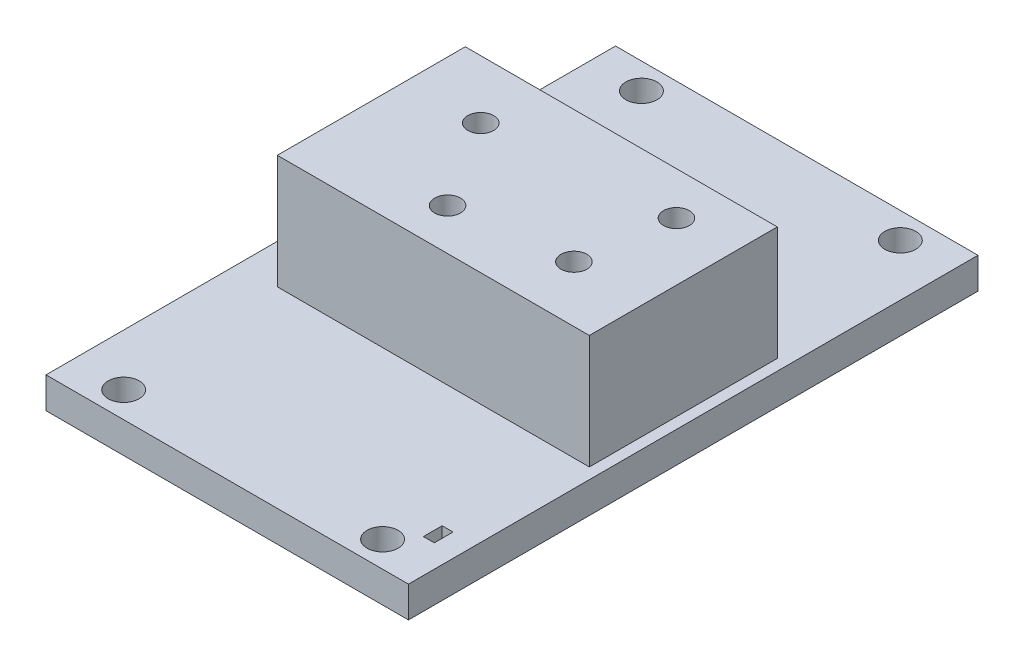
ISO-10303-21;
HEADER;
FILE_DESCRIPTION(('STEP AP214'),'2;1');
FILE_NAME('part.step','',(''),(''),'','','');
FILE_SCHEMA(('AUTOMOTIVE_DESIGN { 1 0 10303 214 1 1 1 1 }'));
ENDSEC;
DATA;
#1=APPLICATION_CONTEXT('core data for automotive mechanical design processes');
#2=APPLICATION_PROTOCOL_DEFINITION('international standard','automotive_design',2000,#1);
#3=PRODUCT_CONTEXT('',#1,'mechanical');
#4=PRODUCT('Part','Part','',(#3));
#5=PRODUCT_RELATED_PRODUCT_CATEGORY('part','',(#4));
#6=PRODUCT_DEFINITION_FORMATION('','',#4);
#7=PRODUCT_DEFINITION_CONTEXT('part definition',#1,'design');
#8=PRODUCT_DEFINITION('design','',#6,#7);
#9=PRODUCT_DEFINITION_SHAPE('','',#8);
#10=(LENGTH_UNIT() NAMED_UNIT(*) SI_UNIT(.MILLI.,.METRE.));
#11=(NAMED_UNIT(*) PLANE_ANGLE_UNIT() SI_UNIT($,.RADIAN.));
#12=(NAMED_UNIT(*) SI_UNIT($,.STERADIAN.) SOLID_ANGLE_UNIT());
#13=UNCERTAINTY_MEASURE_WITH_UNIT(LENGTH_MEASURE(1.E-05),#10,'distance_accuracy_value','');
#14=(GEOMETRIC_REPRESENTATION_CONTEXT(3) GLOBAL_UNCERTAINTY_ASSIGNED_CONTEXT((#13)) GLOBAL_UNIT_ASSIGNED_CONTEXT((#10,
#11,#12)) REPRESENTATION_CONTEXT('',''));
#15=CARTESIAN_POINT('',(0.,0.,0.));
#16=DIRECTION('',(0.,0.,1.));
#17=DIRECTION('',(1.,0.,0.));
#18=AXIS2_PLACEMENT_3D('',#15,#16,#17);
#19=CARTESIAN_POINT('',(0.,3.,0.));
#20=DIRECTION('',(0.,-1.,0.));
#21=DIRECTION('',(0.,0.,-1.));
#22=AXIS2_PLACEMENT_3D('',#19,#20,#21);
#23=PLANE('',#22);
#24=DIRECTION('',(0.,0.,-1.));
#25=VECTOR('',#24,1.);
#26=CARTESIAN_POINT('',(15.2972184874862,3.,20.9911873137618));
#27=LINE('',#26,#25);
#28=CARTESIAN_POINT('',(15.2972184874862,3.,22.8012740109835));
#29=VERTEX_POINT('',#28);
#30=CARTESIAN_POINT('',(15.2972184874862,3.,20.9911873137618));
#31=VERTEX_POINT('',#30);
#32=EDGE_CURVE('E245',#29,#31,#27,.T.);
#33=ORIENTED_EDGE('',*,*,#32,.F.);
#34=DIRECTION('',(1.,0.,0.));
#35=VECTOR('',#34,1.);
#36=CARTESIAN_POINT('',(14.243954382696,3.,22.8012740109835));
#37=LINE('',#36,#35);
#38=CARTESIAN_POINT('',(14.243954382696,3.,22.8012740109835));
#39=VERTEX_POINT('',#38);
#40=EDGE_CURVE('E253',#39,#29,#37,.T.);
#41=ORIENTED_EDGE('',*,*,#40,.F.);
#42=DIRECTION('',(0.,0.,1.));
#43=VECTOR('',#42,1.);
#44=CARTESIAN_POINT('',(14.243954382696,3.,20.9911873137618));
#45=LINE('',#44,#43);
#46=CARTESIAN_POINT('',(14.243954382696,3.,20.9911873137618));
#47=VERTEX_POINT('',#46);
#48=EDGE_CURVE('E250',#47,#39,#45,.T.);
#49=ORIENTED_EDGE('',*,*,#48,.F.);
#50=DIRECTION('',(-1.,0.,0.));
#51=VECTOR('',#50,1.);
#52=CARTESIAN_POINT('',(14.243954382696,3.,20.9911873137618));
#53=LINE('',#52,#51);
#54=EDGE_CURVE('E247',#31,#47,#53,.T.);
#55=ORIENTED_EDGE('',*,*,#54,.F.);
#56=EDGE_LOOP('',(#33,#41,#49,#55));
#57=FACE_BOUND('',#56,.T.);
#58=DIRECTION('',(0.,0.,-1.));
#59=VECTOR('',#58,1.);
#60=CARTESIAN_POINT('',(17.5,3.,27.5));
#61=LINE('',#60,#59);
#62=CARTESIAN_POINT('',(17.5,3.,27.5));
#63=VERTEX_POINT('',#62);
#64=CARTESIAN_POINT('',(17.5,3.,-27.5));
#65=VERTEX_POINT('',#64);
#66=EDGE_CURVE('E300',#63,#65,#61,.T.);
#67=ORIENTED_EDGE('',*,*,#66,.T.);
#68=DIRECTION('',(-1.,0.,0.));
#69=VECTOR('',#68,1.);
#70=CARTESIAN_POINT('',(-17.5,3.,-27.5));
#71=LINE('',#70,#69);
#72=CARTESIAN_POINT('',(-17.5,3.,-27.5));
#73=VERTEX_POINT('',#72);
#74=EDGE_CURVE('E303',#65,#73,#71,.T.);
#75=ORIENTED_EDGE('',*,*,#74,.T.);
#76=DIRECTION('',(0.,0.,1.));
#77=VECTOR('',#76,1.);
#78=CARTESIAN_POINT('',(-17.5,3.,27.5));
#79=LINE('',#78,#77);
#80=CARTESIAN_POINT('',(-17.5,3.,27.5));
#81=VERTEX_POINT('',#80);
#82=EDGE_CURVE('E306',#73,#81,#79,.T.);
#83=ORIENTED_EDGE('',*,*,#82,.T.);
#84=DIRECTION('',(1.,0.,0.));
#85=VECTOR('',#84,1.);
#86=CARTESIAN_POINT('',(-17.5,3.,27.5));
#87=LINE('',#86,#85);
#88=EDGE_CURVE('E308',#81,#63,#87,.T.);
#89=ORIENTED_EDGE('',*,*,#88,.T.);
#90=EDGE_LOOP('',(#67,#75,#83,#89));
#91=FACE_BOUND('',#90,.T.);
#92=CARTESIAN_POINT('',(12.5,3.,-25.));
#93=DIRECTION('',(0.,1.,0.));
#94=DIRECTION('',(0.,0.,1.));
#95=AXIS2_PLACEMENT_3D('',#92,#93,#94);
#96=CIRCLE('',#95,1.5);
#97=CARTESIAN_POINT('',(12.5,3.,-23.5));
#98=VERTEX_POINT('',#97);
#99=EDGE_CURVE('E294',#98,#98,#96,.T.);
#100=ORIENTED_EDGE('',*,*,#99,.F.);
#101=EDGE_LOOP('',(#100));
#102=FACE_BOUND('',#101,.T.);
#103=CARTESIAN_POINT('',(-12.5,3.,-25.));
#104=DIRECTION('',(0.,1.,0.));
#105=DIRECTION('',(0.,0.,1.));
#106=AXIS2_PLACEMENT_3D('',#103,#104,#105);
#107=CIRCLE('',#106,1.5);
#108=CARTESIAN_POINT('',(-12.5,3.,-23.5));
#109=VERTEX_POINT('',#108);
#110=EDGE_CURVE('E288',#109,#109,#107,.T.);
#111=ORIENTED_EDGE('',*,*,#110,.F.);
#112=EDGE_LOOP('',(#111));
#113=FACE_BOUND('',#112,.T.);
#114=CARTESIAN_POINT('',(12.5,3.,25.));
#115=DIRECTION('',(0.,1.,0.));
#116=DIRECTION('',(0.,0.,1.));
#117=AXIS2_PLACEMENT_3D('',#114,#115,#116);
#118=CIRCLE('',#117,1.5);
#119=CARTESIAN_POINT('',(12.5,3.,26.5));
#120=VERTEX_POINT('',#119);
#121=EDGE_CURVE('E282',#120,#120,#118,.T.);
#122=ORIENTED_EDGE('',*,*,#121,.F.);
#123=EDGE_LOOP('',(#122));
#124=FACE_BOUND('',#123,.T.);
#125=CARTESIAN_POINT('',(-12.5,3.,25.));
#126=DIRECTION('',(0.,1.,0.));
#127=DIRECTION('',(0.,0.,1.));
#128=AXIS2_PLACEMENT_3D('',#125,#126,#127);
#129=CIRCLE('',#128,1.5);
#130=CARTESIAN_POINT('',(-12.5,3.,26.5));
#131=VERTEX_POINT('',#130);
#132=EDGE_CURVE('E276',#131,#131,#129,.T.);
#133=ORIENTED_EDGE('',*,*,#132,.F.);
#134=EDGE_LOOP('',(#133));
#135=FACE_BOUND('',#134,.T.);
#136=DIRECTION('',(0.,0.,1.));
#137=VECTOR('',#136,1.);
#138=CARTESIAN_POINT('',(-13.6935756082828,3.,-9.18214889556079));
#139=LINE('',#138,#137);
#140=CARTESIAN_POINT('',(-13.6935756082828,3.,-9.18214889556079));
#141=VERTEX_POINT('',#140);
#142=CARTESIAN_POINT('',(-13.6935756082828,3.,8.96905458068353));
#143=VERTEX_POINT('',#142);
#144=EDGE_CURVE('E214',#141,#143,#139,.T.);
#145=ORIENTED_EDGE('',*,*,#144,.F.);
#146=DIRECTION('',(-1.,0.,0.));
#147=VECTOR('',#146,1.);
#148=CARTESIAN_POINT('',(-13.6935756082828,3.,-9.18214889556079));
#149=LINE('',#148,#147);
#150=CARTESIAN_POINT('',(16.4369304808005,3.,-9.18214889556079));
#151=VERTEX_POINT('',#150);
#152=EDGE_CURVE('E219',#151,#141,#149,.T.);
#153=ORIENTED_EDGE('',*,*,#152,.F.);
#154=DIRECTION('',(0.,0.,-1.));
#155=VECTOR('',#154,1.);
#156=CARTESIAN_POINT('',(16.4369304808005,3.,-9.18214889556079));
#157=LINE('',#156,#155);
#158=CARTESIAN_POINT('',(16.4369304808005,3.,8.96905458068353));
#159=VERTEX_POINT('',#158);
#160=EDGE_CURVE('E229',#159,#151,#157,.T.);
#161=ORIENTED_EDGE('',*,*,#160,.F.);
#162=DIRECTION('',(1.,0.,0.));
#163=VECTOR('',#162,1.);
#164=CARTESIAN_POINT('',(-13.6935756082828,3.,8.96905458068353));
#165=LINE('',#164,#163);
#166=EDGE_CURVE('E65',#143,#159,#165,.T.);
#167=ORIENTED_EDGE('',*,*,#166,.F.);
#168=EDGE_LOOP('',(#145,#153,#161,#167));
#169=FACE_BOUND('',#168,.T.);
#170=ADVANCED_FACE('F41',(#57,#91,#102,#113,#124,#135,#169),#23,.F.);
#171=CARTESIAN_POINT('',(0.,0.,0.));
#172=DIRECTION('',(0.,-1.,0.));
#173=DIRECTION('',(0.,0.,-1.));
#174=AXIS2_PLACEMENT_3D('',#171,#172,#173);
#175=PLANE('',#174);
#176=DIRECTION('',(0.,0.,1.));
#177=VECTOR('',#176,1.);
#178=CARTESIAN_POINT('',(14.2011956372725,0.,8.82957921996308));
#179=LINE('',#178,#177);
#180=CARTESIAN_POINT('',(14.2011956372725,0.,-8.90604424778374));
#181=VERTEX_POINT('',#180);
#182=CARTESIAN_POINT('',(14.2011956372725,0.,8.82957921996308));
#183=VERTEX_POINT('',#182);
#184=EDGE_CURVE('E57',#181,#183,#179,.T.);
#185=ORIENTED_EDGE('',*,*,#184,.F.);
#186=DIRECTION('',(1.,0.,0.));
#187=VECTOR('',#186,1.);
#188=CARTESIAN_POINT('',(14.2011956372725,0.,-8.90604424778374));
#189=LINE('',#188,#187);
#190=CARTESIAN_POINT('',(-11.7714710889043,0.,-8.90604424778374));
#191=VERTEX_POINT('',#190);
#192=EDGE_CURVE('E175',#191,#181,#189,.T.);
#193=ORIENTED_EDGE('',*,*,#192,.F.);
#194=DIRECTION('',(0.,0.,-1.));
#195=VECTOR('',#194,1.);
#196=CARTESIAN_POINT('',(-11.7714710889043,0.,8.82957921996308));
#197=LINE('',#196,#195);
#198=CARTESIAN_POINT('',(-11.7714710889043,0.,8.82957921996308));
#199=VERTEX_POINT('',#198);
#200=EDGE_CURVE('E178',#199,#191,#197,.T.);
#201=ORIENTED_EDGE('',*,*,#200,.F.);
#202=DIRECTION('',(-1.,0.,0.));
#203=VECTOR('',#202,1.);
#204=CARTESIAN_POINT('',(14.2011956372725,0.,8.82957921996308));
#205=LINE('',#204,#203);
#206=EDGE_CURVE('E184',#183,#199,#205,.T.);
#207=ORIENTED_EDGE('',*,*,#206,.F.);
#208=EDGE_LOOP('',(#185,#193,#201,#207));
#209=FACE_BOUND('',#208,.T.);
#210=CARTESIAN_POINT('',(12.5,0.,25.));
#211=DIRECTION('',(0.,1.,0.));
#212=DIRECTION('',(0.,0.,1.));
#213=AXIS2_PLACEMENT_3D('',#210,#211,#212);
#214=CIRCLE('',#213,1.5);
#215=CARTESIAN_POINT('',(12.5,0.,26.5));
#216=VERTEX_POINT('',#215);
#217=EDGE_CURVE('E279',#216,#216,#214,.T.);
#218=ORIENTED_EDGE('',*,*,#217,.T.);
#219=EDGE_LOOP('',(#218));
#220=FACE_BOUND('',#219,.T.);
#221=CARTESIAN_POINT('',(12.5,0.,-25.));
#222=DIRECTION('',(0.,1.,0.));
#223=DIRECTION('',(0.,0.,1.));
#224=AXIS2_PLACEMENT_3D('',#221,#222,#223);
#225=CIRCLE('',#224,1.5);
#226=CARTESIAN_POINT('',(12.5,0.,-23.5));
#227=VERTEX_POINT('',#226);
#228=EDGE_CURVE('E291',#227,#227,#225,.T.);
#229=ORIENTED_EDGE('',*,*,#228,.T.);
#230=EDGE_LOOP('',(#229));
#231=FACE_BOUND('',#230,.T.);
#232=DIRECTION('',(0.,0.,-1.));
#233=VECTOR('',#232,1.);
#234=CARTESIAN_POINT('',(17.5,0.,27.5));
#235=LINE('',#234,#233);
#236=CARTESIAN_POINT('',(17.5,0.,27.5));
#237=VERTEX_POINT('',#236);
#238=CARTESIAN_POINT('',(17.5,0.,-27.5));
#239=VERTEX_POINT('',#238);
#240=EDGE_CURVE('E297',#237,#239,#235,.T.);
#241=ORIENTED_EDGE('',*,*,#240,.F.);
#242=DIRECTION('',(1.,0.,0.));
#243=VECTOR('',#242,1.);
#244=CARTESIAN_POINT('',(-17.5,0.,27.5));
#245=LINE('',#244,#243);
#246=CARTESIAN_POINT('',(-17.5,0.,27.5));
#247=VERTEX_POINT('',#246);
#248=EDGE_CURVE('E304',#247,#237,#245,.T.);
#249=ORIENTED_EDGE('',*,*,#248,.F.);
#250=DIRECTION('',(0.,0.,1.));
#251=VECTOR('',#250,1.);
#252=CARTESIAN_POINT('',(-17.5,0.,27.5));
#253=LINE('',#252,#251);
#254=CARTESIAN_POINT('',(-17.5,0.,-27.5));
#255=VERTEX_POINT('',#254);
#256=EDGE_CURVE('E315',#255,#247,#253,.T.);
#257=ORIENTED_EDGE('',*,*,#256,.F.);
#258=DIRECTION('',(-1.,0.,0.));
#259=VECTOR('',#258,1.);
#260=CARTESIAN_POINT('',(-17.5,0.,-27.5));
#261=LINE('',#260,#259);
#262=EDGE_CURVE('E313',#239,#255,#261,.T.);
#263=ORIENTED_EDGE('',*,*,#262,.F.);
#264=EDGE_LOOP('',(#241,#249,#257,#263));
#265=FACE_BOUND('',#264,.T.);
#266=CARTESIAN_POINT('',(-12.5,0.,-25.));
#267=DIRECTION('',(0.,1.,0.));
#268=DIRECTION('',(0.,0.,1.));
#269=AXIS2_PLACEMENT_3D('',#266,#267,#268);
#270=CIRCLE('',#269,1.5);
#271=CARTESIAN_POINT('',(-12.5,0.,-23.5));
#272=VERTEX_POINT('',#271);
#273=EDGE_CURVE('E285',#272,#272,#270,.T.);
#274=ORIENTED_EDGE('',*,*,#273,.T.);
#275=EDGE_LOOP('',(#274));
#276=FACE_BOUND('',#275,.T.);
#277=CARTESIAN_POINT('',(-12.5,0.,25.));
#278=DIRECTION('',(0.,1.,0.));
#279=DIRECTION('',(0.,0.,1.));
#280=AXIS2_PLACEMENT_3D('',#277,#278,#279);
#281=CIRCLE('',#280,1.5);
#282=CARTESIAN_POINT('',(-12.5,0.,26.5));
#283=VERTEX_POINT('',#282);
#284=EDGE_CURVE('E275',#283,#283,#281,.T.);
#285=ORIENTED_EDGE('',*,*,#284,.T.);
#286=EDGE_LOOP('',(#285));
#287=FACE_BOUND('',#286,.T.);
#288=DIRECTION('',(1.,0.,0.));
#289=VECTOR('',#288,1.);
#290=CARTESIAN_POINT('',(14.243954382696,0.,22.8012740109835));
#291=LINE('',#290,#289);
#292=CARTESIAN_POINT('',(14.243954382696,0.,22.8012740109835));
#293=VERTEX_POINT('',#292);
#294=CARTESIAN_POINT('',(15.2972184874862,0.,22.8012740109835));
#295=VERTEX_POINT('',#294);
#296=EDGE_CURVE('E248',#293,#295,#291,.T.);
#297=ORIENTED_EDGE('',*,*,#296,.T.);
#298=DIRECTION('',(0.,0.,-1.));
#299=VECTOR('',#298,1.);
#300=CARTESIAN_POINT('',(15.2972184874862,0.,20.9911873137618));
#301=LINE('',#300,#299);
#302=CARTESIAN_POINT('',(15.2972184874862,0.,20.9911873137618));
#303=VERTEX_POINT('',#302);
#304=EDGE_CURVE('E244',#295,#303,#301,.T.);
#305=ORIENTED_EDGE('',*,*,#304,.T.);
#306=DIRECTION('',(-1.,0.,0.));
#307=VECTOR('',#306,1.);
#308=CARTESIAN_POINT('',(14.243954382696,0.,20.9911873137618));
#309=LINE('',#308,#307);
#310=CARTESIAN_POINT('',(14.243954382696,0.,20.9911873137618));
#311=VERTEX_POINT('',#310);
#312=EDGE_CURVE('E258',#303,#311,#309,.T.);
#313=ORIENTED_EDGE('',*,*,#312,.T.);
#314=DIRECTION('',(0.,0.,1.));
#315=VECTOR('',#314,1.);
#316=CARTESIAN_POINT('',(14.243954382696,0.,20.9911873137618));
#317=LINE('',#316,#315);
#318=EDGE_CURVE('E261',#311,#293,#317,.T.);
#319=ORIENTED_EDGE('',*,*,#318,.T.);
#320=EDGE_LOOP('',(#297,#305,#313,#319));
#321=FACE_BOUND('',#320,.T.);
#322=ADVANCED_FACE('F334',(#209,#220,#231,#265,#276,#287,#321),#175,.T.);
#323=CARTESIAN_POINT('',(17.5,3.,27.5));
#324=DIRECTION('',(-1.,0.,0.));
#325=DIRECTION('',(0.,0.,1.));
#326=AXIS2_PLACEMENT_3D('',#323,#324,#325);
#327=PLANE('',#326);
#328=ORIENTED_EDGE('',*,*,#240,.T.);
#329=DIRECTION('',(0.,-1.,0.));
#330=VECTOR('',#329,1.);
#331=CARTESIAN_POINT('',(17.5,3.,-27.5));
#332=LINE('',#331,#330);
#333=EDGE_CURVE('E11',#65,#239,#332,.T.);
#334=ORIENTED_EDGE('',*,*,#333,.F.);
#335=ORIENTED_EDGE('',*,*,#66,.F.);
#336=DIRECTION('',(0.,-1.,0.));
#337=VECTOR('',#336,1.);
#338=CARTESIAN_POINT('',(17.5,3.,27.5));
#339=LINE('',#338,#337);
#340=EDGE_CURVE('E310',#63,#237,#339,.T.);
#341=ORIENTED_EDGE('',*,*,#340,.T.);
#342=EDGE_LOOP('',(#328,#334,#335,#341));
#343=FACE_BOUND('',#342,.T.);
#344=ADVANCED_FACE('F43',(#343),#327,.F.);
#345=CARTESIAN_POINT('',(-17.5,3.,-27.5));
#346=DIRECTION('',(0.,0.,1.));
#347=DIRECTION('',(1.,0.,0.));
#348=AXIS2_PLACEMENT_3D('',#345,#346,#347);
#349=PLANE('',#348);
#350=ORIENTED_EDGE('',*,*,#262,.T.);
#351=DIRECTION('',(0.,-1.,0.));
#352=VECTOR('',#351,1.);
#353=CARTESIAN_POINT('',(-17.5,3.,-27.5));
#354=LINE('',#353,#352);
#355=EDGE_CURVE('E50',#73,#255,#354,.T.);
#356=ORIENTED_EDGE('',*,*,#355,.F.);
#357=ORIENTED_EDGE('',*,*,#74,.F.);
#358=ORIENTED_EDGE('',*,*,#333,.T.);
#359=EDGE_LOOP('',(#350,#356,#357,#358));
#360=FACE_BOUND('',#359,.T.);
#361=ADVANCED_FACE('F345',(#360),#349,.F.);
#362=CARTESIAN_POINT('',(-17.5,3.,27.5));
#363=DIRECTION('',(1.,0.,0.));
#364=DIRECTION('',(0.,0.,-1.));
#365=AXIS2_PLACEMENT_3D('',#362,#363,#364);
#366=PLANE('',#365);
#367=ORIENTED_EDGE('',*,*,#256,.T.);
#368=DIRECTION('',(0.,-1.,0.));
#369=VECTOR('',#368,1.);
#370=CARTESIAN_POINT('',(-17.5,3.,27.5));
#371=LINE('',#370,#369);
#372=EDGE_CURVE('E320',#81,#247,#371,.T.);
#373=ORIENTED_EDGE('',*,*,#372,.F.);
#374=ORIENTED_EDGE('',*,*,#82,.F.);
#375=ORIENTED_EDGE('',*,*,#355,.T.);
#376=EDGE_LOOP('',(#367,#373,#374,#375));
#377=FACE_BOUND('',#376,.T.);
#378=ADVANCED_FACE('F328',(#377),#366,.F.);
#379=CARTESIAN_POINT('',(-17.5,3.,27.5));
#380=DIRECTION('',(0.,0.,-1.));
#381=DIRECTION('',(-1.,0.,0.));
#382=AXIS2_PLACEMENT_3D('',#379,#380,#381);
#383=PLANE('',#382);
#384=ORIENTED_EDGE('',*,*,#248,.T.);
#385=ORIENTED_EDGE('',*,*,#340,.F.);
#386=ORIENTED_EDGE('',*,*,#88,.F.);
#387=ORIENTED_EDGE('',*,*,#372,.T.);
#388=EDGE_LOOP('',(#384,#385,#386,#387));
#389=FACE_BOUND('',#388,.T.);
#390=ADVANCED_FACE('F338',(#389),#383,.F.);
#391=CARTESIAN_POINT('',(12.5,3.,-25.));
#392=DIRECTION('',(0.,-1.,0.));
#393=DIRECTION('',(0.,0.,-1.));
#394=AXIS2_PLACEMENT_3D('',#391,#392,#393);
#395=CYLINDRICAL_SURFACE('',#394,1.5);
#396=ORIENTED_EDGE('',*,*,#99,.T.);
#397=EDGE_LOOP('',(#396));
#398=FACE_BOUND('',#397,.T.);
#399=ORIENTED_EDGE('',*,*,#228,.F.);
#400=EDGE_LOOP('',(#399));
#401=FACE_BOUND('',#400,.T.);
#402=ADVANCED_FACE('F362',(#398,#401),#395,.F.);
#403=CARTESIAN_POINT('',(-12.5,3.,-25.));
#404=DIRECTION('',(0.,-1.,0.));
#405=DIRECTION('',(0.,0.,-1.));
#406=AXIS2_PLACEMENT_3D('',#403,#404,#405);
#407=CYLINDRICAL_SURFACE('',#406,1.5);
#408=ORIENTED_EDGE('',*,*,#110,.T.);
#409=EDGE_LOOP('',(#408));
#410=FACE_BOUND('',#409,.T.);
#411=ORIENTED_EDGE('',*,*,#273,.F.);
#412=EDGE_LOOP('',(#411));
#413=FACE_BOUND('',#412,.T.);
#414=ADVANCED_FACE('F369',(#410,#413),#407,.F.);
#415=CARTESIAN_POINT('',(12.5,3.,25.));
#416=DIRECTION('',(0.,-1.,0.));
#417=DIRECTION('',(0.,0.,-1.));
#418=AXIS2_PLACEMENT_3D('',#415,#416,#417);
#419=CYLINDRICAL_SURFACE('',#418,1.5);
#420=ORIENTED_EDGE('',*,*,#121,.T.);
#421=EDGE_LOOP('',(#420));
#422=FACE_BOUND('',#421,.T.);
#423=ORIENTED_EDGE('',*,*,#217,.F.);
#424=EDGE_LOOP('',(#423));
#425=FACE_BOUND('',#424,.T.);
#426=ADVANCED_FACE('F374',(#422,#425),#419,.F.);
#427=CARTESIAN_POINT('',(-12.5,3.,25.));
#428=DIRECTION('',(0.,-1.,0.));
#429=DIRECTION('',(0.,0.,-1.));
#430=AXIS2_PLACEMENT_3D('',#427,#428,#429);
#431=CYLINDRICAL_SURFACE('',#430,1.5);
#432=ORIENTED_EDGE('',*,*,#132,.T.);
#433=EDGE_LOOP('',(#432));
#434=FACE_BOUND('',#433,.T.);
#435=ORIENTED_EDGE('',*,*,#284,.F.);
#436=EDGE_LOOP('',(#435));
#437=FACE_BOUND('',#436,.T.);
#438=ADVANCED_FACE('F444',(#434,#437),#431,.F.);
#439=CARTESIAN_POINT('',(15.2972184874862,3.,20.9911873137618));
#440=DIRECTION('',(-1.,0.,0.));
#441=DIRECTION('',(0.,0.,1.));
#442=AXIS2_PLACEMENT_3D('',#439,#440,#441);
#443=PLANE('',#442);
#444=ORIENTED_EDGE('',*,*,#304,.F.);
#445=DIRECTION('',(0.,-1.,0.));
#446=VECTOR('',#445,1.);
#447=CARTESIAN_POINT('',(15.2972184874862,3.,22.8012740109835));
#448=LINE('',#447,#446);
#449=EDGE_CURVE('E255',#29,#295,#448,.T.);
#450=ORIENTED_EDGE('',*,*,#449,.F.);
#451=ORIENTED_EDGE('',*,*,#32,.T.);
#452=DIRECTION('',(0.,-1.,0.));
#453=VECTOR('',#452,1.);
#454=CARTESIAN_POINT('',(15.2972184874862,3.,20.9911873137618));
#455=LINE('',#454,#453);
#456=EDGE_CURVE('E272',#31,#303,#455,.T.);
#457=ORIENTED_EDGE('',*,*,#456,.T.);
#458=EDGE_LOOP('',(#444,#450,#451,#457));
#459=FACE_BOUND('',#458,.T.);
#460=ADVANCED_FACE('F440',(#459),#443,.T.);
#461=CARTESIAN_POINT('',(14.243954382696,3.,20.9911873137618));
#462=DIRECTION('',(0.,0.,1.));
#463=DIRECTION('',(1.,0.,0.));
#464=AXIS2_PLACEMENT_3D('',#461,#462,#463);
#465=PLANE('',#464);
#466=ORIENTED_EDGE('',*,*,#312,.F.);
#467=ORIENTED_EDGE('',*,*,#456,.F.);
#468=ORIENTED_EDGE('',*,*,#54,.T.);
#469=DIRECTION('',(0.,-1.,0.));
#470=VECTOR('',#469,1.);
#471=CARTESIAN_POINT('',(14.243954382696,3.,20.9911873137618));
#472=LINE('',#471,#470);
#473=EDGE_CURVE('E270',#47,#311,#472,.T.);
#474=ORIENTED_EDGE('',*,*,#473,.T.);
#475=EDGE_LOOP('',(#466,#467,#468,#474));
#476=FACE_BOUND('',#475,.T.);
#477=ADVANCED_FACE('F436',(#476),#465,.T.);
#478=CARTESIAN_POINT('',(14.243954382696,3.,20.9911873137618));
#479=DIRECTION('',(1.,0.,0.));
#480=DIRECTION('',(0.,0.,-1.));
#481=AXIS2_PLACEMENT_3D('',#478,#479,#480);
#482=PLANE('',#481);
#483=ORIENTED_EDGE('',*,*,#318,.F.);
#484=ORIENTED_EDGE('',*,*,#473,.F.);
#485=ORIENTED_EDGE('',*,*,#48,.T.);
#486=DIRECTION('',(0.,-1.,0.));
#487=VECTOR('',#486,1.);
#488=CARTESIAN_POINT('',(14.243954382696,3.,22.8012740109835));
#489=LINE('',#488,#487);
#490=EDGE_CURVE('E268',#39,#293,#489,.T.);
#491=ORIENTED_EDGE('',*,*,#490,.T.);
#492=EDGE_LOOP('',(#483,#484,#485,#491));
#493=FACE_BOUND('',#492,.T.);
#494=ADVANCED_FACE('F432',(#493),#482,.T.);
#495=CARTESIAN_POINT('',(14.243954382696,3.,22.8012740109835));
#496=DIRECTION('',(0.,0.,-1.));
#497=DIRECTION('',(-1.,0.,0.));
#498=AXIS2_PLACEMENT_3D('',#495,#496,#497);
#499=PLANE('',#498);
#500=ORIENTED_EDGE('',*,*,#296,.F.);
#501=ORIENTED_EDGE('',*,*,#490,.F.);
#502=ORIENTED_EDGE('',*,*,#40,.T.);
#503=ORIENTED_EDGE('',*,*,#449,.T.);
#504=EDGE_LOOP('',(#500,#501,#502,#503));
#505=FACE_BOUND('',#504,.T.);
#506=ADVANCED_FACE('F428',(#505),#499,.T.);
#507=CARTESIAN_POINT('',(-1.27000000000001,3.,4.95));
#508=DIRECTION('',(0.,-1.,0.));
#509=DIRECTION('',(0.,0.,-1.));
#510=AXIS2_PLACEMENT_3D('',#507,#508,#509);
#511=CYLINDRICAL_SURFACE('',#510,1.25);
#512=CARTESIAN_POINT('',(-1.27000000000001,4.,4.95));
#513=DIRECTION('',(0.,1.,0.));
#514=DIRECTION('',(0.,0.,1.));
#515=AXIS2_PLACEMENT_3D('',#512,#513,#514);
#516=CIRCLE('',#515,1.25);
#517=CARTESIAN_POINT('',(-1.27000000000001,4.,6.2));
#518=VERTEX_POINT('',#517);
#519=EDGE_CURVE('E199',#518,#518,#516,.T.);
#520=ORIENTED_EDGE('',*,*,#519,.F.);
#521=EDGE_LOOP('',(#520));
#522=FACE_BOUND('',#521,.T.);
#523=CARTESIAN_POINT('',(-1.27000000000001,14.,4.95));
#524=DIRECTION('',(0.,-1.,0.));
#525=DIRECTION('',(0.,0.,-1.));
#526=AXIS2_PLACEMENT_3D('',#523,#524,#525);
#527=CIRCLE('',#526,1.25);
#528=CARTESIAN_POINT('',(-1.27000000000001,14.,3.7));
#529=VERTEX_POINT('',#528);
#530=EDGE_CURVE('E209',#529,#529,#527,.T.);
#531=ORIENTED_EDGE('',*,*,#530,.F.);
#532=EDGE_LOOP('',(#531));
#533=FACE_BOUND('',#532,.T.);
#534=ADVANCED_FACE('F424',(#522,#533),#511,.F.);
#535=CARTESIAN_POINT('',(-6.57000000000001,3.,-3.55));
#536=DIRECTION('',(0.,-1.,0.));
#537=DIRECTION('',(0.,0.,-1.));
#538=AXIS2_PLACEMENT_3D('',#535,#536,#537);
#539=CYLINDRICAL_SURFACE('',#538,1.25);
#540=CARTESIAN_POINT('',(-6.57000000000001,4.,-3.55));
#541=DIRECTION('',(0.,1.,0.));
#542=DIRECTION('',(0.,0.,1.));
#543=AXIS2_PLACEMENT_3D('',#540,#541,#542);
#544=CIRCLE('',#543,1.25);
#545=CARTESIAN_POINT('',(-6.57000000000001,4.,-2.3));
#546=VERTEX_POINT('',#545);
#547=EDGE_CURVE('E196',#546,#546,#544,.T.);
#548=ORIENTED_EDGE('',*,*,#547,.F.);
#549=EDGE_LOOP('',(#548));
#550=FACE_BOUND('',#549,.T.);
#551=CARTESIAN_POINT('',(-6.57000000000001,14.,-3.55));
#552=DIRECTION('',(0.,-1.,0.));
#553=DIRECTION('',(0.,0.,-1.));
#554=AXIS2_PLACEMENT_3D('',#551,#552,#553);
#555=CIRCLE('',#554,1.25);
#556=CARTESIAN_POINT('',(-6.57000000000001,14.,-4.8));
#557=VERTEX_POINT('',#556);
#558=EDGE_CURVE('E206',#557,#557,#555,.T.);
#559=ORIENTED_EDGE('',*,*,#558,.F.);
#560=EDGE_LOOP('',(#559));
#561=FACE_BOUND('',#560,.T.);
#562=ADVANCED_FACE('F420',(#550,#561),#539,.F.);
#563=CARTESIAN_POINT('',(10.83,3.,-5.05));
#564=DIRECTION('',(0.,-1.,0.));
#565=DIRECTION('',(0.,0.,-1.));
#566=AXIS2_PLACEMENT_3D('',#563,#564,#565);
#567=CYLINDRICAL_SURFACE('',#566,1.25);
#568=CARTESIAN_POINT('',(10.83,4.,-5.05));
#569=DIRECTION('',(0.,1.,0.));
#570=DIRECTION('',(0.,0.,1.));
#571=AXIS2_PLACEMENT_3D('',#568,#569,#570);
#572=CIRCLE('',#571,1.25);
#573=CARTESIAN_POINT('',(10.83,4.,-3.8));
#574=VERTEX_POINT('',#573);
#575=EDGE_CURVE('E193',#574,#574,#572,.T.);
#576=ORIENTED_EDGE('',*,*,#575,.F.);
#577=EDGE_LOOP('',(#576));
#578=FACE_BOUND('',#577,.T.);
#579=CARTESIAN_POINT('',(10.83,14.,-5.05));
#580=DIRECTION('',(0.,-1.,0.));
#581=DIRECTION('',(0.,0.,-1.));
#582=AXIS2_PLACEMENT_3D('',#579,#580,#581);
#583=CIRCLE('',#582,1.25);
#584=CARTESIAN_POINT('',(10.83,14.,-6.3));
#585=VERTEX_POINT('',#584);
#586=EDGE_CURVE('E202',#585,#585,#583,.T.);
#587=ORIENTED_EDGE('',*,*,#586,.F.);
#588=EDGE_LOOP('',(#587));
#589=FACE_BOUND('',#588,.T.);
#590=ADVANCED_FACE('F416',(#578,#589),#567,.F.);
#591=CARTESIAN_POINT('',(9.52999999999999,3.,3.55));
#592=DIRECTION('',(0.,-1.,0.));
#593=DIRECTION('',(0.,0.,-1.));
#594=AXIS2_PLACEMENT_3D('',#591,#592,#593);
#595=CYLINDRICAL_SURFACE('',#594,1.25);
#596=CARTESIAN_POINT('',(9.52999999999999,4.,3.55));
#597=DIRECTION('',(0.,1.,0.));
#598=DIRECTION('',(0.,0.,1.));
#599=AXIS2_PLACEMENT_3D('',#596,#597,#598);
#600=CIRCLE('',#599,1.25);
#601=CARTESIAN_POINT('',(9.52999999999999,4.,4.8));
#602=VERTEX_POINT('',#601);
#603=EDGE_CURVE('E45',#602,#602,#600,.T.);
#604=ORIENTED_EDGE('',*,*,#603,.F.);
#605=EDGE_LOOP('',(#604));
#606=FACE_BOUND('',#605,.T.);
#607=CARTESIAN_POINT('',(9.52999999999999,14.,3.55));
#608=DIRECTION('',(0.,-1.,0.));
#609=DIRECTION('',(0.,0.,-1.));
#610=AXIS2_PLACEMENT_3D('',#607,#608,#609);
#611=CIRCLE('',#610,1.25);
#612=CARTESIAN_POINT('',(9.52999999999999,14.,2.3));
#613=VERTEX_POINT('',#612);
#614=EDGE_CURVE('E205',#613,#613,#611,.T.);
#615=ORIENTED_EDGE('',*,*,#614,.F.);
#616=EDGE_LOOP('',(#615));
#617=FACE_BOUND('',#616,.T.);
#618=ADVANCED_FACE('F410',(#606,#617),#595,.F.);
#619=CARTESIAN_POINT('',(-13.6935756082828,14.,-9.18214889556079));
#620=DIRECTION('',(1.,0.,0.));
#621=DIRECTION('',(0.,0.,-1.));
#622=AXIS2_PLACEMENT_3D('',#619,#620,#621);
#623=PLANE('',#622);
#624=ORIENTED_EDGE('',*,*,#144,.T.);
#625=DIRECTION('',(0.,-1.,0.));
#626=VECTOR('',#625,1.);
#627=CARTESIAN_POINT('',(-13.6935756082828,14.,8.96905458068353));
#628=LINE('',#627,#626);
#629=CARTESIAN_POINT('',(-13.6935756082828,14.,8.96905458068353));
#630=VERTEX_POINT('',#629);
#631=EDGE_CURVE('E242',#630,#143,#628,.T.);
#632=ORIENTED_EDGE('',*,*,#631,.F.);
#633=DIRECTION('',(0.,0.,1.));
#634=VECTOR('',#633,1.);
#635=CARTESIAN_POINT('',(-13.6935756082828,14.,-9.18214889556079));
#636=LINE('',#635,#634);
#637=CARTESIAN_POINT('',(-13.6935756082828,14.,-9.18214889556079));
#638=VERTEX_POINT('',#637);
#639=EDGE_CURVE('E215',#638,#630,#636,.T.);
#640=ORIENTED_EDGE('',*,*,#639,.F.);
#641=DIRECTION('',(0.,-1.,0.));
#642=VECTOR('',#641,1.);
#643=CARTESIAN_POINT('',(-13.6935756082828,14.,-9.18214889556079));
#644=LINE('',#643,#642);
#645=EDGE_CURVE('E225',#638,#141,#644,.T.);
#646=ORIENTED_EDGE('',*,*,#645,.T.);
#647=EDGE_LOOP('',(#624,#632,#640,#646));
#648=FACE_BOUND('',#647,.T.);
#649=ADVANCED_FACE('F394',(#648),#623,.F.);
#650=CARTESIAN_POINT('',(-13.6935756082828,14.,8.96905458068353));
#651=DIRECTION('',(0.,0.,-1.));
#652=DIRECTION('',(-1.,0.,0.));
#653=AXIS2_PLACEMENT_3D('',#650,#651,#652);
#654=PLANE('',#653);
#655=ORIENTED_EDGE('',*,*,#166,.T.);
#656=DIRECTION('',(0.,-1.,0.));
#657=VECTOR('',#656,1.);
#658=CARTESIAN_POINT('',(16.4369304808005,14.,8.96905458068353));
#659=LINE('',#658,#657);
#660=CARTESIAN_POINT('',(16.4369304808005,14.,8.96905458068353));
#661=VERTEX_POINT('',#660);
#662=EDGE_CURVE('E239',#661,#159,#659,.T.);
#663=ORIENTED_EDGE('',*,*,#662,.F.);
#664=DIRECTION('',(1.,0.,0.));
#665=VECTOR('',#664,1.);
#666=CARTESIAN_POINT('',(-13.6935756082828,14.,8.96905458068353));
#667=LINE('',#666,#665);
#668=EDGE_CURVE('E218',#630,#661,#667,.T.);
#669=ORIENTED_EDGE('',*,*,#668,.F.);
#670=ORIENTED_EDGE('',*,*,#631,.T.);
#671=EDGE_LOOP('',(#655,#663,#669,#670));
#672=FACE_BOUND('',#671,.T.);
#673=ADVANCED_FACE('F402',(#672),#654,.F.);
#674=CARTESIAN_POINT('',(16.4369304808005,14.,-9.18214889556079));
#675=DIRECTION('',(-1.,0.,0.));
#676=DIRECTION('',(0.,0.,1.));
#677=AXIS2_PLACEMENT_3D('',#674,#675,#676);
#678=PLANE('',#677);
#679=ORIENTED_EDGE('',*,*,#160,.T.);
#680=DIRECTION('',(0.,-1.,0.));
#681=VECTOR('',#680,1.);
#682=CARTESIAN_POINT('',(16.4369304808005,14.,-9.18214889556079));
#683=LINE('',#682,#681);
#684=CARTESIAN_POINT('',(16.4369304808005,14.,-9.18214889556079));
#685=VERTEX_POINT('',#684);
#686=EDGE_CURVE('E236',#685,#151,#683,.T.);
#687=ORIENTED_EDGE('',*,*,#686,.F.);
#688=DIRECTION('',(0.,0.,-1.));
#689=VECTOR('',#688,1.);
#690=CARTESIAN_POINT('',(16.4369304808005,14.,-9.18214889556079));
#691=LINE('',#690,#689);
#692=EDGE_CURVE('E221',#661,#685,#691,.T.);
#693=ORIENTED_EDGE('',*,*,#692,.F.);
#694=ORIENTED_EDGE('',*,*,#662,.T.);
#695=EDGE_LOOP('',(#679,#687,#693,#694));
#696=FACE_BOUND('',#695,.T.);
#697=ADVANCED_FACE('F400',(#696),#678,.F.);
#698=CARTESIAN_POINT('',(-13.6935756082828,14.,-9.18214889556079));
#699=DIRECTION('',(0.,0.,1.));
#700=DIRECTION('',(1.,0.,0.));
#701=AXIS2_PLACEMENT_3D('',#698,#699,#700);
#702=PLANE('',#701);
#703=ORIENTED_EDGE('',*,*,#152,.T.);
#704=ORIENTED_EDGE('',*,*,#645,.F.);
#705=DIRECTION('',(-1.,0.,0.));
#706=VECTOR('',#705,1.);
#707=CARTESIAN_POINT('',(-13.6935756082828,14.,-9.18214889556079));
#708=LINE('',#707,#706);
#709=EDGE_CURVE('E223',#685,#638,#708,.T.);
#710=ORIENTED_EDGE('',*,*,#709,.F.);
#711=ORIENTED_EDGE('',*,*,#686,.T.);
#712=EDGE_LOOP('',(#703,#704,#710,#711));
#713=FACE_BOUND('',#712,.T.);
#714=ADVANCED_FACE('F390',(#713),#702,.F.);
#715=CARTESIAN_POINT('',(0.,14.,0.));
#716=DIRECTION('',(0.,1.,0.));
#717=DIRECTION('',(0.,0.,1.));
#718=AXIS2_PLACEMENT_3D('',#715,#716,#717);
#719=PLANE('',#718);
#720=ORIENTED_EDGE('',*,*,#558,.T.);
#721=EDGE_LOOP('',(#720));
#722=FACE_BOUND('',#721,.T.);
#723=ORIENTED_EDGE('',*,*,#614,.T.);
#724=EDGE_LOOP('',(#723));
#725=FACE_BOUND('',#724,.T.);
#726=ORIENTED_EDGE('',*,*,#586,.T.);
#727=EDGE_LOOP('',(#726));
#728=FACE_BOUND('',#727,.T.);
#729=ORIENTED_EDGE('',*,*,#530,.T.);
#730=EDGE_LOOP('',(#729));
#731=FACE_BOUND('',#730,.T.);
#732=ORIENTED_EDGE('',*,*,#639,.T.);
#733=ORIENTED_EDGE('',*,*,#668,.T.);
#734=ORIENTED_EDGE('',*,*,#692,.T.);
#735=ORIENTED_EDGE('',*,*,#709,.T.);
#736=EDGE_LOOP('',(#732,#733,#734,#735));
#737=FACE_BOUND('',#736,.T.);
#738=ADVANCED_FACE('F396',(#722,#725,#728,#731,#737),#719,.T.);
#739=CARTESIAN_POINT('',(14.2011956372725,4.,8.82957921996308));
#740=DIRECTION('',(1.,0.,0.));
#741=DIRECTION('',(0.,0.,-1.));
#742=AXIS2_PLACEMENT_3D('',#739,#740,#741);
#743=PLANE('',#742);
#744=ORIENTED_EDGE('',*,*,#184,.T.);
#745=DIRECTION('',(0.,-1.,0.));
#746=VECTOR('',#745,1.);
#747=CARTESIAN_POINT('',(14.2011956372725,4.,8.82957921996308));
#748=LINE('',#747,#746);
#749=CARTESIAN_POINT('',(14.2011956372725,4.,8.82957921996308));
#750=VERTEX_POINT('',#749);
#751=EDGE_CURVE('E153',#750,#183,#748,.T.);
#752=ORIENTED_EDGE('',*,*,#751,.F.);
#753=DIRECTION('',(0.,0.,1.));
#754=VECTOR('',#753,1.);
#755=CARTESIAN_POINT('',(14.2011956372725,4.,8.82957921996308));
#756=LINE('',#755,#754);
#757=CARTESIAN_POINT('',(14.2011956372725,4.,-8.90604424778374));
#758=VERTEX_POINT('',#757);
#759=EDGE_CURVE('E157',#758,#750,#756,.T.);
#760=ORIENTED_EDGE('',*,*,#759,.F.);
#761=DIRECTION('',(0.,-1.,0.));
#762=VECTOR('',#761,1.);
#763=CARTESIAN_POINT('',(14.2011956372725,4.,-8.90604424778374));
#764=LINE('',#763,#762);
#765=EDGE_CURVE('E188',#758,#181,#764,.T.);
#766=ORIENTED_EDGE('',*,*,#765,.T.);
#767=EDGE_LOOP('',(#744,#752,#760,#766));
#768=FACE_BOUND('',#767,.T.);
#769=ADVANCED_FACE('F155',(#768),#743,.F.);
#770=CARTESIAN_POINT('',(14.2011956372725,4.,-8.90604424778374));
#771=DIRECTION('',(0.,0.,-1.));
#772=DIRECTION('',(-1.,0.,0.));
#773=AXIS2_PLACEMENT_3D('',#770,#771,#772);
#774=PLANE('',#773);
#775=ORIENTED_EDGE('',*,*,#192,.T.);
#776=ORIENTED_EDGE('',*,*,#765,.F.);
#777=DIRECTION('',(1.,0.,0.));
#778=VECTOR('',#777,1.);
#779=CARTESIAN_POINT('',(14.2011956372725,4.,-8.90604424778374));
#780=LINE('',#779,#778);
#781=CARTESIAN_POINT('',(-11.7714710889043,4.,-8.90604424778374));
#782=VERTEX_POINT('',#781);
#783=EDGE_CURVE('E163',#782,#758,#780,.T.);
#784=ORIENTED_EDGE('',*,*,#783,.F.);
#785=DIRECTION('',(0.,-1.,0.));
#786=VECTOR('',#785,1.);
#787=CARTESIAN_POINT('',(-11.7714710889043,4.,-8.90604424778374));
#788=LINE('',#787,#786);
#789=EDGE_CURVE('E190',#782,#191,#788,.T.);
#790=ORIENTED_EDGE('',*,*,#789,.T.);
#791=EDGE_LOOP('',(#775,#776,#784,#790));
#792=FACE_BOUND('',#791,.T.);
#793=ADVANCED_FACE('F644',(#792),#774,.F.);
#794=CARTESIAN_POINT('',(-11.7714710889043,4.,8.82957921996308));
#795=DIRECTION('',(-1.,0.,0.));
#796=DIRECTION('',(0.,0.,1.));
#797=AXIS2_PLACEMENT_3D('',#794,#795,#796);
#798=PLANE('',#797);
#799=ORIENTED_EDGE('',*,*,#200,.T.);
#800=ORIENTED_EDGE('',*,*,#789,.F.);
#801=DIRECTION('',(0.,0.,-1.));
#802=VECTOR('',#801,1.);
#803=CARTESIAN_POINT('',(-11.7714710889043,4.,8.82957921996308));
#804=LINE('',#803,#802);
#805=CARTESIAN_POINT('',(-11.7714710889043,4.,8.82957921996308));
#806=VERTEX_POINT('',#805);
#807=EDGE_CURVE('E171',#806,#782,#804,.T.);
#808=ORIENTED_EDGE('',*,*,#807,.F.);
#809=DIRECTION('',(0.,-1.,0.));
#810=VECTOR('',#809,1.);
#811=CARTESIAN_POINT('',(-11.7714710889043,4.,8.82957921996308));
#812=LINE('',#811,#810);
#813=EDGE_CURVE('E162',#806,#199,#812,.T.);
#814=ORIENTED_EDGE('',*,*,#813,.T.);
#815=EDGE_LOOP('',(#799,#800,#808,#814));
#816=FACE_BOUND('',#815,.T.);
#817=ADVANCED_FACE('F652',(#816),#798,.F.);
#818=CARTESIAN_POINT('',(14.2011956372725,4.,8.82957921996308));
#819=DIRECTION('',(0.,0.,1.));
#820=DIRECTION('',(1.,0.,0.));
#821=AXIS2_PLACEMENT_3D('',#818,#819,#820);
#822=PLANE('',#821);
#823=ORIENTED_EDGE('',*,*,#206,.T.);
#824=ORIENTED_EDGE('',*,*,#813,.F.);
#825=DIRECTION('',(-1.,0.,0.));
#826=VECTOR('',#825,1.);
#827=CARTESIAN_POINT('',(14.2011956372725,4.,8.82957921996308));
#828=LINE('',#827,#826);
#829=EDGE_CURVE('E166',#750,#806,#828,.T.);
#830=ORIENTED_EDGE('',*,*,#829,.F.);
#831=ORIENTED_EDGE('',*,*,#751,.T.);
#832=EDGE_LOOP('',(#823,#824,#830,#831));
#833=FACE_BOUND('',#832,.T.);
#834=ADVANCED_FACE('F167',(#833),#822,.F.);
#835=CARTESIAN_POINT('',(0.,4.,0.));
#836=DIRECTION('',(0.,1.,0.));
#837=DIRECTION('',(0.,0.,1.));
#838=AXIS2_PLACEMENT_3D('',#835,#836,#837);
#839=PLANE('',#838);
#840=ORIENTED_EDGE('',*,*,#519,.T.);
#841=EDGE_LOOP('',(#840));
#842=FACE_BOUND('',#841,.T.);
#843=ORIENTED_EDGE('',*,*,#547,.T.);
#844=EDGE_LOOP('',(#843));
#845=FACE_BOUND('',#844,.T.);
#846=ORIENTED_EDGE('',*,*,#575,.T.);
#847=EDGE_LOOP('',(#846));
#848=FACE_BOUND('',#847,.T.);
#849=ORIENTED_EDGE('',*,*,#603,.T.);
#850=EDGE_LOOP('',(#849));
#851=FACE_BOUND('',#850,.T.);
#852=ORIENTED_EDGE('',*,*,#759,.T.);
#853=ORIENTED_EDGE('',*,*,#829,.T.);
#854=ORIENTED_EDGE('',*,*,#807,.T.);
#855=ORIENTED_EDGE('',*,*,#783,.T.);
#856=EDGE_LOOP('',(#852,#853,#854,#855));
#857=FACE_BOUND('',#856,.T.);
#858=ADVANCED_FACE('F173',(#842,#845,#848,#851,#857),#839,.F.);
#859=CLOSED_SHELL('',(#170,#322,#344,#361,#378,#390,#402,#414,#426,#438,#460,#477,#494,#506,
#534,#562,#590,#618,#649,#673,#697,#714,#738,#769,#793,#817,#834,#858));
#860=MANIFOLD_SOLID_BREP('B2',#859);
#861=ADVANCED_BREP_SHAPE_REPRESENTATION('',(#18,#860),#14);
#862=SHAPE_DEFINITION_REPRESENTATION(#9,#861);
ENDSEC;
END-ISO-10303-21;
